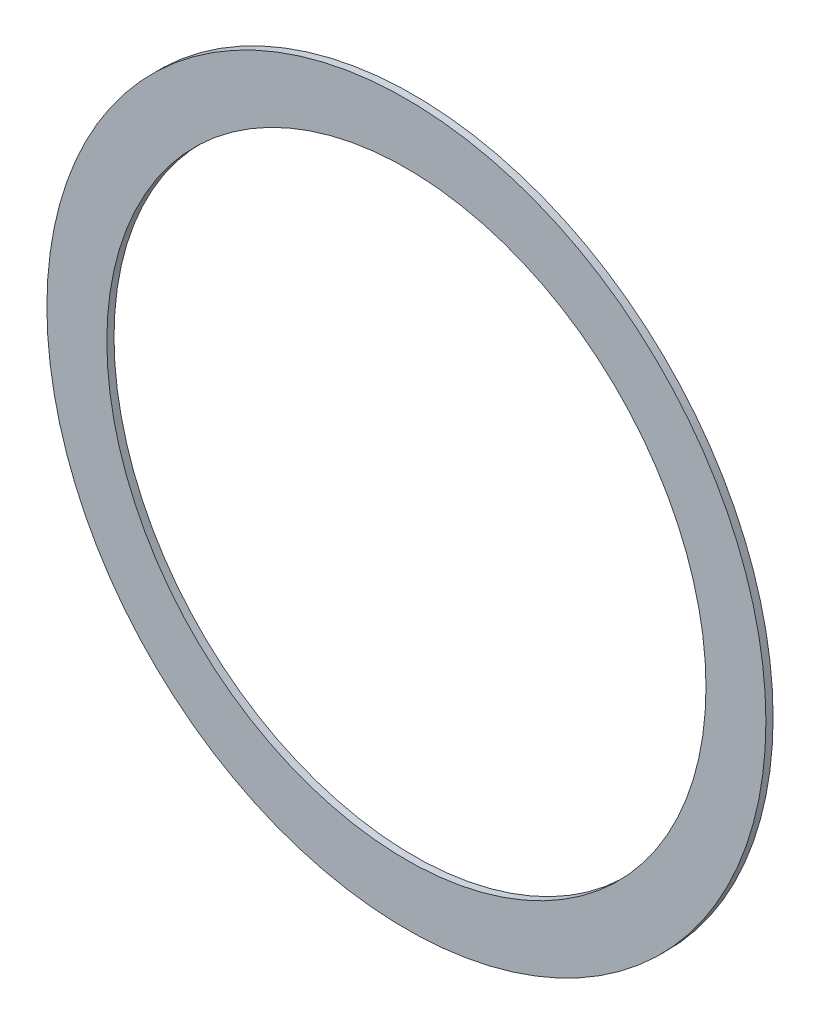
ISO-10303-21;
HEADER;
FILE_DESCRIPTION(('STEP AP214'),'2;1');
FILE_NAME('part.step','',(''),(''),'','','');
FILE_SCHEMA(('AUTOMOTIVE_DESIGN { 1 0 10303 214 1 1 1 1 }'));
ENDSEC;
DATA;
#1=APPLICATION_CONTEXT('core data for automotive mechanical design processes');
#2=APPLICATION_PROTOCOL_DEFINITION('international standard','automotive_design',2000,#1);
#3=PRODUCT_CONTEXT('',#1,'mechanical');
#4=PRODUCT('Part','Part','',(#3));
#5=PRODUCT_RELATED_PRODUCT_CATEGORY('part','',(#4));
#6=PRODUCT_DEFINITION_FORMATION('','',#4);
#7=PRODUCT_DEFINITION_CONTEXT('part definition',#1,'design');
#8=PRODUCT_DEFINITION('design','',#6,#7);
#9=PRODUCT_DEFINITION_SHAPE('','',#8);
#10=(LENGTH_UNIT() NAMED_UNIT(*) SI_UNIT(.MILLI.,.METRE.));
#11=(NAMED_UNIT(*) PLANE_ANGLE_UNIT() SI_UNIT($,.RADIAN.));
#12=(NAMED_UNIT(*) SI_UNIT($,.STERADIAN.) SOLID_ANGLE_UNIT());
#13=UNCERTAINTY_MEASURE_WITH_UNIT(LENGTH_MEASURE(1.E-05),#10,'distance_accuracy_value','');
#14=(GEOMETRIC_REPRESENTATION_CONTEXT(3) GLOBAL_UNCERTAINTY_ASSIGNED_CONTEXT((#13)) GLOBAL_UNIT_ASSIGNED_CONTEXT((#10,
#11,#12)) REPRESENTATION_CONTEXT('',''));
#15=CARTESIAN_POINT('',(0.,0.,0.));
#16=DIRECTION('',(0.,0.,1.));
#17=DIRECTION('',(1.,0.,0.));
#18=AXIS2_PLACEMENT_3D('',#15,#16,#17);
#19=CARTESIAN_POINT('',(0.,0.,-0.381));
#20=DIRECTION('',(0.,0.,1.));
#21=DIRECTION('',(1.,0.,0.));
#22=AXIS2_PLACEMENT_3D('',#19,#20,#21);
#23=CYLINDRICAL_SURFACE('',#22,19.05);
#24=CARTESIAN_POINT('',(0.,0.,-0.381));
#25=DIRECTION('',(0.,0.,1.));
#26=DIRECTION('',(1.,0.,0.));
#27=AXIS2_PLACEMENT_3D('',#24,#25,#26);
#28=CIRCLE('',#27,19.05);
#29=CARTESIAN_POINT('',(19.05,0.,-0.381));
#30=VERTEX_POINT('',#29);
#31=EDGE_CURVE('E10',#30,#30,#28,.T.);
#32=CARTESIAN_POINT('',(0.,0.,0.));
#33=DIRECTION('',(0.,0.,1.));
#34=DIRECTION('',(1.,0.,0.));
#35=AXIS2_PLACEMENT_3D('',#32,#33,#34);
#36=CIRCLE('',#35,19.05);
#37=CARTESIAN_POINT('',(19.05,0.,0.));
#38=VERTEX_POINT('',#37);
#39=EDGE_CURVE('E35',#38,#38,#36,.T.);
#40=CARTESIAN_POINT('',(19.05,0.,-0.381));
#41=CARTESIAN_POINT('',(19.05,0.,-0.37703125));
#42=CARTESIAN_POINT('',(19.05,0.,-0.3730625));
#43=CARTESIAN_POINT('',(19.05,0.,-0.365125));
#44=CARTESIAN_POINT('',(19.05,0.,-0.36115625));
#45=CARTESIAN_POINT('',(19.05,0.,-0.35321875));
#46=CARTESIAN_POINT('',(19.05,0.,-0.34925));
#47=CARTESIAN_POINT('',(19.05,0.,-0.3413125));
#48=CARTESIAN_POINT('',(19.05,0.,-0.33734375));
#49=CARTESIAN_POINT('',(19.05,0.,-0.32940625));
#50=CARTESIAN_POINT('',(19.05,0.,-0.3254375));
#51=CARTESIAN_POINT('',(19.05,0.,-0.3175));
#52=CARTESIAN_POINT('',(19.05,0.,-0.31353125));
#53=CARTESIAN_POINT('',(19.05,0.,-0.30559375));
#54=CARTESIAN_POINT('',(19.05,0.,-0.301625));
#55=CARTESIAN_POINT('',(19.05,0.,-0.2936875));
#56=CARTESIAN_POINT('',(19.05,0.,-0.28971875));
#57=CARTESIAN_POINT('',(19.05,0.,-0.28178125));
#58=CARTESIAN_POINT('',(19.05,0.,-0.2778125));
#59=CARTESIAN_POINT('',(19.05,0.,-0.269875));
#60=CARTESIAN_POINT('',(19.05,0.,-0.26590625));
#61=CARTESIAN_POINT('',(19.05,0.,-0.25796875));
#62=CARTESIAN_POINT('',(19.05,0.,-0.254));
#63=CARTESIAN_POINT('',(19.05,0.,-0.2460625));
#64=CARTESIAN_POINT('',(19.05,0.,-0.24209375));
#65=CARTESIAN_POINT('',(19.05,0.,-0.23415625));
#66=CARTESIAN_POINT('',(19.05,0.,-0.2301875));
#67=CARTESIAN_POINT('',(19.05,0.,-0.22225));
#68=CARTESIAN_POINT('',(19.05,0.,-0.21828125));
#69=CARTESIAN_POINT('',(19.05,0.,-0.21034375));
#70=CARTESIAN_POINT('',(19.05,0.,-0.206375));
#71=CARTESIAN_POINT('',(19.05,0.,-0.1984375));
#72=CARTESIAN_POINT('',(19.05,0.,-0.19446875));
#73=CARTESIAN_POINT('',(19.05,0.,-0.18653125));
#74=CARTESIAN_POINT('',(19.05,0.,-0.1825625));
#75=CARTESIAN_POINT('',(19.05,0.,-0.174625));
#76=CARTESIAN_POINT('',(19.05,0.,-0.17065625));
#77=CARTESIAN_POINT('',(19.05,0.,-0.16271875));
#78=CARTESIAN_POINT('',(19.05,0.,-0.15875));
#79=CARTESIAN_POINT('',(19.05,0.,-0.1508125));
#80=CARTESIAN_POINT('',(19.05,0.,-0.14684375));
#81=CARTESIAN_POINT('',(19.05,0.,-0.13890625));
#82=CARTESIAN_POINT('',(19.05,0.,-0.1349375));
#83=CARTESIAN_POINT('',(19.05,0.,-0.127));
#84=CARTESIAN_POINT('',(19.05,0.,-0.12303125));
#85=CARTESIAN_POINT('',(19.05,0.,-0.11509375));
#86=CARTESIAN_POINT('',(19.05,0.,-0.111125));
#87=CARTESIAN_POINT('',(19.05,0.,-0.1031875));
#88=CARTESIAN_POINT('',(19.05,0.,-0.09921875));
#89=CARTESIAN_POINT('',(19.05,0.,-0.09128125));
#90=CARTESIAN_POINT('',(19.05,0.,-0.0873125));
#91=CARTESIAN_POINT('',(19.05,0.,-0.079375));
#92=CARTESIAN_POINT('',(19.05,0.,-0.07540625));
#93=CARTESIAN_POINT('',(19.05,0.,-0.06746875));
#94=CARTESIAN_POINT('',(19.05,0.,-0.0635));
#95=CARTESIAN_POINT('',(19.05,0.,-0.0555625));
#96=CARTESIAN_POINT('',(19.05,0.,-0.05159375));
#97=CARTESIAN_POINT('',(19.05,0.,-0.04365625));
#98=CARTESIAN_POINT('',(19.05,0.,-0.0396875));
#99=CARTESIAN_POINT('',(19.05,0.,-0.03175));
#100=CARTESIAN_POINT('',(19.05,0.,-0.02778125));
#101=CARTESIAN_POINT('',(19.05,0.,-0.01984375));
#102=CARTESIAN_POINT('',(19.05,0.,-0.015875));
#103=CARTESIAN_POINT('',(19.05,0.,-0.00793749999999999));
#104=CARTESIAN_POINT('',(19.05,0.,-0.00396874999999999));
#105=CARTESIAN_POINT('',(19.05,0.,0.));
#106=B_SPLINE_CURVE_WITH_KNOTS('',3,(#40,#41,#42,#43,#44,#45,#46,#47,#48,#49,#50,#51,#52,#53,
#54,#55,#56,#57,#58,#59,#60,#61,#62,#63,#64,#65,#66,#67,#68,#69,#70,#71,#72,#73,#74,#75,#76,#77,
#78,#79,#80,#81,#82,#83,#84,#85,#86,#87,#88,#89,#90,#91,#92,#93,#94,#95,#96,#97,#98,#99,#100,
#101,#102,#103,#104,#105),.UNSPECIFIED.,.F.,.F.,(4,2,2,2,2,2,2,2,2,2,2,2,2,2,2,2,2,2,2,2,2,2,2,
2,2,2,2,2,2,2,2,2,4),(0.,0.01190625,0.0238125,0.03571875,0.047625,0.05953125,0.0714375,
0.08334375,0.0952500000000001,0.10715625,0.1190625,0.13096875,0.142875,0.15478125,0.1666875,
0.17859375,0.1905,0.20240625,0.2143125,0.22621875,0.238125,0.25003125,0.2619375,0.27384375,
0.28575,0.29765625,0.3095625,0.32146875,0.333375,0.34528125,0.3571875,0.36909375,0.381),.UNSPECIFIED.);
#107=EDGE_CURVE('BSEAM32',#30,#38,#106,.T.);
#108=ORIENTED_EDGE('',*,*,#31,.T.);
#109=ORIENTED_EDGE('',*,*,#39,.F.);
#110=ORIENTED_EDGE('',*,*,#107,.T.);
#111=ORIENTED_EDGE('',*,*,#107,.F.);
#112=EDGE_LOOP('',(#108,#110,#109,#111));
#113=FACE_BOUND('',#112,.T.);
#114=ADVANCED_FACE('F32',(#113),#23,.T.);
#115=CARTESIAN_POINT('',(0.,0.,-0.381));
#116=DIRECTION('',(0.,0.,1.));
#117=DIRECTION('',(1.,0.,0.));
#118=AXIS2_PLACEMENT_3D('',#115,#116,#117);
#119=PLANE('',#118);
#120=CARTESIAN_POINT('',(0.,0.,-0.381));
#121=DIRECTION('',(0.,0.,1.));
#122=DIRECTION('',(1.,0.,0.));
#123=AXIS2_PLACEMENT_3D('',#120,#121,#122);
#124=CIRCLE('',#123,15.875);
#125=CARTESIAN_POINT('',(15.875,0.,-0.381));
#126=VERTEX_POINT('',#125);
#127=EDGE_CURVE('E42',#126,#126,#124,.T.);
#128=ORIENTED_EDGE('',*,*,#127,.T.);
#129=EDGE_LOOP('',(#128));
#130=FACE_BOUND('',#129,.T.);
#131=ORIENTED_EDGE('',*,*,#31,.F.);
#132=EDGE_LOOP('',(#131));
#133=FACE_BOUND('',#132,.T.);
#134=ADVANCED_FACE('F50',(#130,#133),#119,.F.);
#135=CARTESIAN_POINT('',(0.,0.,0.));
#136=DIRECTION('',(0.,0.,1.));
#137=DIRECTION('',(1.,0.,0.));
#138=AXIS2_PLACEMENT_3D('',#135,#136,#137);
#139=PLANE('',#138);
#140=CARTESIAN_POINT('',(0.,0.,0.));
#141=DIRECTION('',(0.,0.,1.));
#142=DIRECTION('',(1.,0.,0.));
#143=AXIS2_PLACEMENT_3D('',#140,#141,#142);
#144=CIRCLE('',#143,15.875);
#145=CARTESIAN_POINT('',(15.875,0.,0.));
#146=VERTEX_POINT('',#145);
#147=EDGE_CURVE('E44',#146,#146,#144,.T.);
#148=ORIENTED_EDGE('',*,*,#147,.F.);
#149=EDGE_LOOP('',(#148));
#150=FACE_BOUND('',#149,.T.);
#151=ORIENTED_EDGE('',*,*,#39,.T.);
#152=EDGE_LOOP('',(#151));
#153=FACE_BOUND('',#152,.T.);
#154=ADVANCED_FACE('F56',(#150,#153),#139,.T.);
#155=CARTESIAN_POINT('',(0.,0.,-0.381));
#156=DIRECTION('',(0.,0.,1.));
#157=DIRECTION('',(1.,0.,0.));
#158=AXIS2_PLACEMENT_3D('',#155,#156,#157);
#159=CYLINDRICAL_SURFACE('',#158,15.875);
#160=CARTESIAN_POINT('',(15.875,0.,-0.381));
#161=CARTESIAN_POINT('',(15.875,0.,-0.37703125));
#162=CARTESIAN_POINT('',(15.875,0.,-0.3730625));
#163=CARTESIAN_POINT('',(15.875,0.,-0.365125));
#164=CARTESIAN_POINT('',(15.875,0.,-0.36115625));
#165=CARTESIAN_POINT('',(15.875,0.,-0.35321875));
#166=CARTESIAN_POINT('',(15.875,0.,-0.34925));
#167=CARTESIAN_POINT('',(15.875,0.,-0.3413125));
#168=CARTESIAN_POINT('',(15.875,0.,-0.33734375));
#169=CARTESIAN_POINT('',(15.875,0.,-0.32940625));
#170=CARTESIAN_POINT('',(15.875,0.,-0.3254375));
#171=CARTESIAN_POINT('',(15.875,0.,-0.3175));
#172=CARTESIAN_POINT('',(15.875,0.,-0.31353125));
#173=CARTESIAN_POINT('',(15.875,0.,-0.30559375));
#174=CARTESIAN_POINT('',(15.875,0.,-0.301625));
#175=CARTESIAN_POINT('',(15.875,0.,-0.2936875));
#176=CARTESIAN_POINT('',(15.875,0.,-0.28971875));
#177=CARTESIAN_POINT('',(15.875,0.,-0.28178125));
#178=CARTESIAN_POINT('',(15.875,0.,-0.2778125));
#179=CARTESIAN_POINT('',(15.875,0.,-0.269875));
#180=CARTESIAN_POINT('',(15.875,0.,-0.26590625));
#181=CARTESIAN_POINT('',(15.875,0.,-0.25796875));
#182=CARTESIAN_POINT('',(15.875,0.,-0.254));
#183=CARTESIAN_POINT('',(15.875,0.,-0.2460625));
#184=CARTESIAN_POINT('',(15.875,0.,-0.24209375));
#185=CARTESIAN_POINT('',(15.875,0.,-0.23415625));
#186=CARTESIAN_POINT('',(15.875,0.,-0.2301875));
#187=CARTESIAN_POINT('',(15.875,0.,-0.22225));
#188=CARTESIAN_POINT('',(15.875,0.,-0.21828125));
#189=CARTESIAN_POINT('',(15.875,0.,-0.21034375));
#190=CARTESIAN_POINT('',(15.875,0.,-0.206375));
#191=CARTESIAN_POINT('',(15.875,0.,-0.1984375));
#192=CARTESIAN_POINT('',(15.875,0.,-0.19446875));
#193=CARTESIAN_POINT('',(15.875,0.,-0.18653125));
#194=CARTESIAN_POINT('',(15.875,0.,-0.1825625));
#195=CARTESIAN_POINT('',(15.875,0.,-0.174625));
#196=CARTESIAN_POINT('',(15.875,0.,-0.17065625));
#197=CARTESIAN_POINT('',(15.875,0.,-0.16271875));
#198=CARTESIAN_POINT('',(15.875,0.,-0.15875));
#199=CARTESIAN_POINT('',(15.875,0.,-0.1508125));
#200=CARTESIAN_POINT('',(15.875,0.,-0.14684375));
#201=CARTESIAN_POINT('',(15.875,0.,-0.13890625));
#202=CARTESIAN_POINT('',(15.875,0.,-0.1349375));
#203=CARTESIAN_POINT('',(15.875,0.,-0.127));
#204=CARTESIAN_POINT('',(15.875,0.,-0.12303125));
#205=CARTESIAN_POINT('',(15.875,0.,-0.11509375));
#206=CARTESIAN_POINT('',(15.875,0.,-0.111125));
#207=CARTESIAN_POINT('',(15.875,0.,-0.1031875));
#208=CARTESIAN_POINT('',(15.875,0.,-0.09921875));
#209=CARTESIAN_POINT('',(15.875,0.,-0.09128125));
#210=CARTESIAN_POINT('',(15.875,0.,-0.0873125));
#211=CARTESIAN_POINT('',(15.875,0.,-0.079375));
#212=CARTESIAN_POINT('',(15.875,0.,-0.07540625));
#213=CARTESIAN_POINT('',(15.875,0.,-0.06746875));
#214=CARTESIAN_POINT('',(15.875,0.,-0.0635));
#215=CARTESIAN_POINT('',(15.875,0.,-0.0555625));
#216=CARTESIAN_POINT('',(15.875,0.,-0.05159375));
#217=CARTESIAN_POINT('',(15.875,0.,-0.04365625));
#218=CARTESIAN_POINT('',(15.875,0.,-0.0396875));
#219=CARTESIAN_POINT('',(15.875,0.,-0.03175));
#220=CARTESIAN_POINT('',(15.875,0.,-0.02778125));
#221=CARTESIAN_POINT('',(15.875,0.,-0.01984375));
#222=CARTESIAN_POINT('',(15.875,0.,-0.015875));
#223=CARTESIAN_POINT('',(15.875,0.,-0.00793749999999999));
#224=CARTESIAN_POINT('',(15.875,0.,-0.00396874999999999));
#225=CARTESIAN_POINT('',(15.875,0.,0.));
#226=B_SPLINE_CURVE_WITH_KNOTS('',3,(#160,#161,#162,#163,#164,#165,#166,#167,#168,#169,#170,
#171,#172,#173,#174,#175,#176,#177,#178,#179,#180,#181,#182,#183,#184,#185,#186,#187,#188,#189,
#190,#191,#192,#193,#194,#195,#196,#197,#198,#199,#200,#201,#202,#203,#204,#205,#206,#207,#208,
#209,#210,#211,#212,#213,#214,#215,#216,#217,#218,#219,#220,#221,#222,#223,#224,#225),
.UNSPECIFIED.,.F.,.F.,(4,2,2,2,2,2,2,2,2,2,2,2,2,2,2,2,2,2,2,2,2,2,2,2,2,2,2,2,2,2,2,2,4),(0.,
0.01190625,0.0238125,0.03571875,0.047625,0.05953125,0.0714375,0.08334375,0.0952500000000001,
0.10715625,0.1190625,0.13096875,0.142875,0.15478125,0.1666875,0.17859375,0.1905,0.20240625,
0.2143125,0.22621875,0.238125,0.25003125,0.2619375,0.27384375,0.28575,0.29765625,0.3095625,
0.32146875,0.333375,0.34528125,0.3571875,0.36909375,0.381),.UNSPECIFIED.);
#227=EDGE_CURVE('BSEAM53',#126,#146,#226,.T.);
#228=ORIENTED_EDGE('',*,*,#127,.F.);
#229=ORIENTED_EDGE('',*,*,#147,.T.);
#230=ORIENTED_EDGE('',*,*,#227,.T.);
#231=ORIENTED_EDGE('',*,*,#227,.F.);
#232=EDGE_LOOP('',(#228,#230,#229,#231));
#233=FACE_BOUND('',#232,.T.);
#234=ADVANCED_FACE('F53',(#233),#159,.F.);
#235=CLOSED_SHELL('',(#114,#134,#154,#234));
#236=MANIFOLD_SOLID_BREP('B2',#235);
#237=ADVANCED_BREP_SHAPE_REPRESENTATION('',(#18,#236),#14);
#238=SHAPE_DEFINITION_REPRESENTATION(#9,#237);
ENDSEC;
END-ISO-10303-21;
